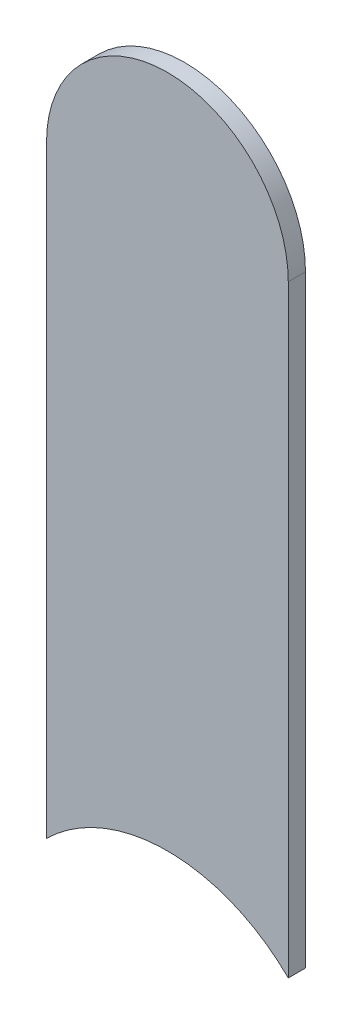
ISO-10303-21;
HEADER;
FILE_DESCRIPTION(('STEP AP214'),'2;1');
FILE_NAME('part.step','',(''),(''),'','','');
FILE_SCHEMA(('AUTOMOTIVE_DESIGN { 1 0 10303 214 1 1 1 1 }'));
ENDSEC;
DATA;
#1=APPLICATION_CONTEXT('core data for automotive mechanical design processes');
#2=APPLICATION_PROTOCOL_DEFINITION('international standard','automotive_design',2000,#1);
#3=PRODUCT_CONTEXT('',#1,'mechanical');
#4=PRODUCT('Part','Part','',(#3));
#5=PRODUCT_RELATED_PRODUCT_CATEGORY('part','',(#4));
#6=PRODUCT_DEFINITION_FORMATION('','',#4);
#7=PRODUCT_DEFINITION_CONTEXT('part definition',#1,'design');
#8=PRODUCT_DEFINITION('design','',#6,#7);
#9=PRODUCT_DEFINITION_SHAPE('','',#8);
#10=(LENGTH_UNIT() NAMED_UNIT(*) SI_UNIT(.MILLI.,.METRE.));
#11=(NAMED_UNIT(*) PLANE_ANGLE_UNIT() SI_UNIT($,.RADIAN.));
#12=(NAMED_UNIT(*) SI_UNIT($,.STERADIAN.) SOLID_ANGLE_UNIT());
#13=UNCERTAINTY_MEASURE_WITH_UNIT(LENGTH_MEASURE(1.E-05),#10,'distance_accuracy_value','');
#14=(GEOMETRIC_REPRESENTATION_CONTEXT(3) GLOBAL_UNCERTAINTY_ASSIGNED_CONTEXT((#13)) GLOBAL_UNIT_ASSIGNED_CONTEXT((#10,
#11,#12)) REPRESENTATION_CONTEXT('',''));
#15=CARTESIAN_POINT('',(0.,0.,0.));
#16=DIRECTION('',(0.,0.,1.));
#17=DIRECTION('',(1.,0.,0.));
#18=AXIS2_PLACEMENT_3D('',#15,#16,#17);
#19=CARTESIAN_POINT('',(54.14999838,71.7528857955931,0.));
#20=DIRECTION('',(-1.,0.,0.));
#21=DIRECTION('',(0.,1.,0.));
#22=AXIS2_PLACEMENT_3D('',#19,#20,#21);
#23=PLANE('',#22);
#24=DIRECTION('',(0.,1.,0.));
#25=VECTOR('',#24,1.);
#26=CARTESIAN_POINT('',(54.14999838,71.49999924,0.03556));
#27=LINE('',#26,#25);
#28=CARTESIAN_POINT('',(54.14999838,71.7528857955931,0.03556));
#29=VERTEX_POINT('',#28);
#30=CARTESIAN_POINT('',(54.14999838,73.00000132,0.03556));
#31=VERTEX_POINT('',#30);
#32=EDGE_CURVE('E11',#29,#31,#27,.T.);
#33=ORIENTED_EDGE('',*,*,#32,.F.);
#34=DIRECTION('',(0.,0.,1.));
#35=VECTOR('',#34,1.);
#36=CARTESIAN_POINT('',(54.14999838,71.7528857955931,0.));
#37=LINE('',#36,#35);
#38=CARTESIAN_POINT('',(54.14999838,71.7528857955931,0.));
#39=VERTEX_POINT('',#38);
#40=EDGE_CURVE('E24',#39,#29,#37,.T.);
#41=ORIENTED_EDGE('',*,*,#40,.F.);
#42=DIRECTION('',(0.,1.,0.));
#43=VECTOR('',#42,1.);
#44=CARTESIAN_POINT('',(54.14999838,71.49999924,0.));
#45=LINE('',#44,#43);
#46=CARTESIAN_POINT('',(54.14999838,73.00000132,0.));
#47=VERTEX_POINT('',#46);
#48=EDGE_CURVE('E75',#39,#47,#45,.T.);
#49=ORIENTED_EDGE('',*,*,#48,.T.);
#50=DIRECTION('',(0.,0.,1.));
#51=VECTOR('',#50,1.);
#52=CARTESIAN_POINT('',(54.14999838,73.00000132,0.));
#53=LINE('',#52,#51);
#54=EDGE_CURVE('E37',#47,#31,#53,.T.);
#55=ORIENTED_EDGE('',*,*,#54,.T.);
#56=EDGE_LOOP('',(#33,#41,#49,#55));
#57=FACE_BOUND('',#56,.T.);
#58=ADVANCED_FACE('F17',(#57),#23,.F.);
#59=CARTESIAN_POINT('',(53.89999888,73.00000132,0.));
#60=DIRECTION('',(0.,0.,-1.));
#61=DIRECTION('',(1.,0.,0.));
#62=AXIS2_PLACEMENT_3D('',#59,#60,#61);
#63=CYLINDRICAL_SURFACE('',#62,0.249999499999999);
#64=CARTESIAN_POINT('',(53.89999888,73.00000132,0.03556));
#65=DIRECTION('',(0.,0.,1.));
#66=DIRECTION('',(1.,0.,0.));
#67=AXIS2_PLACEMENT_3D('',#64,#65,#66);
#68=CIRCLE('',#67,0.249999499999999);
#69=CARTESIAN_POINT('',(53.64999938,73.00000132,0.03556));
#70=VERTEX_POINT('',#69);
#71=EDGE_CURVE('E83',#31,#70,#68,.T.);
#72=ORIENTED_EDGE('',*,*,#71,.F.);
#73=ORIENTED_EDGE('',*,*,#54,.F.);
#74=CARTESIAN_POINT('',(53.89999888,73.00000132,0.));
#75=DIRECTION('',(0.,0.,1.));
#76=DIRECTION('',(1.,0.,0.));
#77=AXIS2_PLACEMENT_3D('',#74,#75,#76);
#78=CIRCLE('',#77,0.249999499999999);
#79=CARTESIAN_POINT('',(53.64999938,73.00000132,0.));
#80=VERTEX_POINT('',#79);
#81=EDGE_CURVE('E81',#47,#80,#78,.T.);
#82=ORIENTED_EDGE('',*,*,#81,.T.);
#83=DIRECTION('',(0.,0.,1.));
#84=VECTOR('',#83,1.);
#85=CARTESIAN_POINT('',(53.64999938,73.00000132,0.));
#86=LINE('',#85,#84);
#87=EDGE_CURVE('E67',#80,#70,#86,.T.);
#88=ORIENTED_EDGE('',*,*,#87,.T.);
#89=EDGE_LOOP('',(#72,#73,#82,#88));
#90=FACE_BOUND('',#89,.T.);
#91=ADVANCED_FACE('F89',(#90),#63,.T.);
#92=CARTESIAN_POINT('',(53.64999938,73.00000132,0.));
#93=DIRECTION('',(1.,0.,0.));
#94=DIRECTION('',(0.,-1.,0.));
#95=AXIS2_PLACEMENT_3D('',#92,#93,#94);
#96=PLANE('',#95);
#97=DIRECTION('',(0.,-1.,0.));
#98=VECTOR('',#97,1.);
#99=CARTESIAN_POINT('',(53.64999938,73.00000132,0.03556));
#100=LINE('',#99,#98);
#101=CARTESIAN_POINT('',(53.64999938,71.7528857955931,0.03556));
#102=VERTEX_POINT('',#101);
#103=EDGE_CURVE('E71',#70,#102,#100,.T.);
#104=ORIENTED_EDGE('',*,*,#103,.F.);
#105=ORIENTED_EDGE('',*,*,#87,.F.);
#106=DIRECTION('',(0.,-1.,0.));
#107=VECTOR('',#106,1.);
#108=CARTESIAN_POINT('',(53.64999938,73.00000132,0.));
#109=LINE('',#108,#107);
#110=CARTESIAN_POINT('',(53.64999938,71.7528857955931,0.));
#111=VERTEX_POINT('',#110);
#112=EDGE_CURVE('E63',#80,#111,#109,.T.);
#113=ORIENTED_EDGE('',*,*,#112,.T.);
#114=DIRECTION('',(0.,0.,1.));
#115=VECTOR('',#114,1.);
#116=CARTESIAN_POINT('',(53.64999938,71.7528857955931,0.));
#117=LINE('',#116,#115);
#118=EDGE_CURVE('E53',#111,#102,#117,.T.);
#119=ORIENTED_EDGE('',*,*,#118,.T.);
#120=EDGE_LOOP('',(#104,#105,#113,#119));
#121=FACE_BOUND('',#120,.T.);
#122=ADVANCED_FACE('F66',(#121),#96,.F.);
#123=CARTESIAN_POINT('',(53.89999888,71.49999924,0.));
#124=DIRECTION('',(0.,0.,-1.));
#125=DIRECTION('',(1.,0.,0.));
#126=AXIS2_PLACEMENT_3D('',#123,#124,#125);
#127=CYLINDRICAL_SURFACE('',#126,0.3556);
#128=ORIENTED_EDGE('',*,*,#40,.T.);
#129=CARTESIAN_POINT('',(53.89999888,71.49999924,0.03556));
#130=DIRECTION('',(0.,0.,1.));
#131=DIRECTION('',(1.,0.,0.));
#132=AXIS2_PLACEMENT_3D('',#129,#130,#131);
#133=CIRCLE('',#132,0.3556);
#134=EDGE_CURVE('E59',#29,#102,#133,.T.);
#135=ORIENTED_EDGE('',*,*,#134,.T.);
#136=ORIENTED_EDGE('',*,*,#118,.F.);
#137=CARTESIAN_POINT('',(53.89999888,71.49999924,0.));
#138=DIRECTION('',(0.,0.,1.));
#139=DIRECTION('',(1.,0.,0.));
#140=AXIS2_PLACEMENT_3D('',#137,#138,#139);
#141=CIRCLE('',#140,0.3556);
#142=EDGE_CURVE('E57',#39,#111,#141,.T.);
#143=ORIENTED_EDGE('',*,*,#142,.F.);
#144=EDGE_LOOP('',(#128,#135,#136,#143));
#145=FACE_BOUND('',#144,.T.);
#146=ADVANCED_FACE('F55',(#145),#127,.F.);
#147=CARTESIAN_POINT('',(54.14999838,71.49999924,0.));
#148=DIRECTION('',(0.,0.,-1.));
#149=DIRECTION('',(-1.,0.,0.));
#150=AXIS2_PLACEMENT_3D('',#147,#148,#149);
#151=PLANE('',#150);
#152=ORIENTED_EDGE('',*,*,#48,.F.);
#153=ORIENTED_EDGE('',*,*,#142,.T.);
#154=ORIENTED_EDGE('',*,*,#112,.F.);
#155=ORIENTED_EDGE('',*,*,#81,.F.);
#156=EDGE_LOOP('',(#152,#153,#154,#155));
#157=FACE_BOUND('',#156,.T.);
#158=ADVANCED_FACE('F74',(#157),#151,.T.);
#159=CARTESIAN_POINT('',(54.14999838,71.49999924,0.03556));
#160=DIRECTION('',(0.,0.,-1.));
#161=DIRECTION('',(-1.,0.,0.));
#162=AXIS2_PLACEMENT_3D('',#159,#160,#161);
#163=PLANE('',#162);
#164=ORIENTED_EDGE('',*,*,#134,.F.);
#165=ORIENTED_EDGE('',*,*,#32,.T.);
#166=ORIENTED_EDGE('',*,*,#71,.T.);
#167=ORIENTED_EDGE('',*,*,#103,.T.);
#168=EDGE_LOOP('',(#164,#165,#166,#167));
#169=FACE_BOUND('',#168,.T.);
#170=ADVANCED_FACE('F91',(#169),#163,.F.);
#171=CLOSED_SHELL('',(#58,#91,#122,#146,#158,#170));
#172=MANIFOLD_SOLID_BREP('B1',#171);
#173=ADVANCED_BREP_SHAPE_REPRESENTATION('',(#18,#172),#14);
#174=SHAPE_DEFINITION_REPRESENTATION(#9,#173);
ENDSEC;
END-ISO-10303-21;
